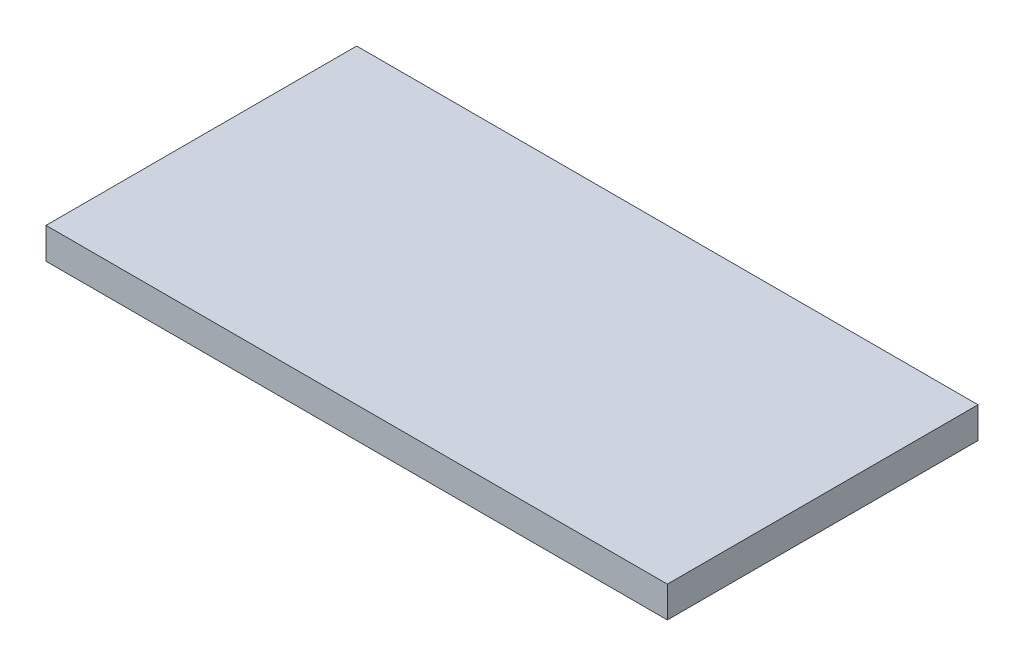
ISO-10303-21;
HEADER;
FILE_DESCRIPTION(('STEP AP214'),'2;1');
FILE_NAME('part.step','',(''),(''),'','','');
FILE_SCHEMA(('AUTOMOTIVE_DESIGN { 1 0 10303 214 1 1 1 1 }'));
ENDSEC;
DATA;
#1=APPLICATION_CONTEXT('core data for automotive mechanical design processes');
#2=APPLICATION_PROTOCOL_DEFINITION('international standard','automotive_design',2000,#1);
#3=PRODUCT_CONTEXT('',#1,'mechanical');
#4=PRODUCT('Part','Part','',(#3));
#5=PRODUCT_RELATED_PRODUCT_CATEGORY('part','',(#4));
#6=PRODUCT_DEFINITION_FORMATION('','',#4);
#7=PRODUCT_DEFINITION_CONTEXT('part definition',#1,'design');
#8=PRODUCT_DEFINITION('design','',#6,#7);
#9=PRODUCT_DEFINITION_SHAPE('','',#8);
#10=(LENGTH_UNIT() NAMED_UNIT(*) SI_UNIT(.MILLI.,.METRE.));
#11=(NAMED_UNIT(*) PLANE_ANGLE_UNIT() SI_UNIT($,.RADIAN.));
#12=(NAMED_UNIT(*) SI_UNIT($,.STERADIAN.) SOLID_ANGLE_UNIT());
#13=UNCERTAINTY_MEASURE_WITH_UNIT(LENGTH_MEASURE(1.E-05),#10,'distance_accuracy_value','');
#14=(GEOMETRIC_REPRESENTATION_CONTEXT(3) GLOBAL_UNCERTAINTY_ASSIGNED_CONTEXT((#13)) GLOBAL_UNIT_ASSIGNED_CONTEXT((#10,
#11,#12)) REPRESENTATION_CONTEXT('',''));
#15=CARTESIAN_POINT('',(0.,0.,0.));
#16=DIRECTION('',(0.,0.,1.));
#17=DIRECTION('',(1.,0.,0.));
#18=AXIS2_PLACEMENT_3D('',#15,#16,#17);
#19=CARTESIAN_POINT('',(63.5,6.35,-31.75));
#20=DIRECTION('',(-1.,0.,0.));
#21=DIRECTION('',(0.,0.,1.));
#22=AXIS2_PLACEMENT_3D('',#19,#20,#21);
#23=PLANE('',#22);
#24=DIRECTION('',(0.,0.,-1.));
#25=VECTOR('',#24,1.);
#26=CARTESIAN_POINT('',(63.5,0.,-31.75));
#27=LINE('',#26,#25);
#28=CARTESIAN_POINT('',(63.5,0.,31.75));
#29=VERTEX_POINT('',#28);
#30=CARTESIAN_POINT('',(63.5,0.,-31.75));
#31=VERTEX_POINT('',#30);
#32=EDGE_CURVE('E99',#29,#31,#27,.T.);
#33=ORIENTED_EDGE('',*,*,#32,.T.);
#34=DIRECTION('',(0.,-1.,0.));
#35=VECTOR('',#34,1.);
#36=CARTESIAN_POINT('',(63.5,6.35,-31.75));
#37=LINE('',#36,#35);
#38=CARTESIAN_POINT('',(63.5,6.35,-31.75));
#39=VERTEX_POINT('',#38);
#40=EDGE_CURVE('E11',#39,#31,#37,.T.);
#41=ORIENTED_EDGE('',*,*,#40,.F.);
#42=DIRECTION('',(0.,0.,-1.));
#43=VECTOR('',#42,1.);
#44=CARTESIAN_POINT('',(63.5,6.35,-31.75));
#45=LINE('',#44,#43);
#46=CARTESIAN_POINT('',(63.5,6.35,31.75));
#47=VERTEX_POINT('',#46);
#48=EDGE_CURVE('E87',#47,#39,#45,.T.);
#49=ORIENTED_EDGE('',*,*,#48,.F.);
#50=DIRECTION('',(0.,-1.,0.));
#51=VECTOR('',#50,1.);
#52=CARTESIAN_POINT('',(63.5,6.35,31.75));
#53=LINE('',#52,#51);
#54=EDGE_CURVE('E95',#47,#29,#53,.T.);
#55=ORIENTED_EDGE('',*,*,#54,.T.);
#56=EDGE_LOOP('',(#33,#41,#49,#55));
#57=FACE_BOUND('',#56,.T.);
#58=ADVANCED_FACE('F36',(#57),#23,.F.);
#59=CARTESIAN_POINT('',(-63.5,6.35,-31.75));
#60=DIRECTION('',(0.,0.,1.));
#61=DIRECTION('',(1.,0.,0.));
#62=AXIS2_PLACEMENT_3D('',#59,#60,#61);
#63=PLANE('',#62);
#64=DIRECTION('',(-1.,0.,0.));
#65=VECTOR('',#64,1.);
#66=CARTESIAN_POINT('',(-63.5,0.,-31.75));
#67=LINE('',#66,#65);
#68=CARTESIAN_POINT('',(-63.5,0.,-31.75));
#69=VERTEX_POINT('',#68);
#70=EDGE_CURVE('E91',#31,#69,#67,.T.);
#71=ORIENTED_EDGE('',*,*,#70,.T.);
#72=DIRECTION('',(0.,-1.,0.));
#73=VECTOR('',#72,1.);
#74=CARTESIAN_POINT('',(-63.5,6.35,-31.75));
#75=LINE('',#74,#73);
#76=CARTESIAN_POINT('',(-63.5,6.35,-31.75));
#77=VERTEX_POINT('',#76);
#78=EDGE_CURVE('E44',#77,#69,#75,.T.);
#79=ORIENTED_EDGE('',*,*,#78,.F.);
#80=DIRECTION('',(-1.,0.,0.));
#81=VECTOR('',#80,1.);
#82=CARTESIAN_POINT('',(-63.5,6.35,-31.75));
#83=LINE('',#82,#81);
#84=EDGE_CURVE('E82',#39,#77,#83,.T.);
#85=ORIENTED_EDGE('',*,*,#84,.F.);
#86=ORIENTED_EDGE('',*,*,#40,.T.);
#87=EDGE_LOOP('',(#71,#79,#85,#86));
#88=FACE_BOUND('',#87,.T.);
#89=ADVANCED_FACE('F90',(#88),#63,.F.);
#90=CARTESIAN_POINT('',(-63.5,6.35,-31.75));
#91=DIRECTION('',(1.,0.,0.));
#92=DIRECTION('',(0.,0.,-1.));
#93=AXIS2_PLACEMENT_3D('',#90,#91,#92);
#94=PLANE('',#93);
#95=DIRECTION('',(0.,0.,1.));
#96=VECTOR('',#95,1.);
#97=CARTESIAN_POINT('',(-63.5,0.,-31.75));
#98=LINE('',#97,#96);
#99=CARTESIAN_POINT('',(-63.5,0.,31.75));
#100=VERTEX_POINT('',#99);
#101=EDGE_CURVE('E69',#69,#100,#98,.T.);
#102=ORIENTED_EDGE('',*,*,#101,.T.);
#103=DIRECTION('',(0.,-1.,0.));
#104=VECTOR('',#103,1.);
#105=CARTESIAN_POINT('',(-63.5,6.35,31.75));
#106=LINE('',#105,#104);
#107=CARTESIAN_POINT('',(-63.5,6.35,31.75));
#108=VERTEX_POINT('',#107);
#109=EDGE_CURVE('E92',#108,#100,#106,.T.);
#110=ORIENTED_EDGE('',*,*,#109,.F.);
#111=DIRECTION('',(0.,0.,1.));
#112=VECTOR('',#111,1.);
#113=CARTESIAN_POINT('',(-63.5,6.35,-31.75));
#114=LINE('',#113,#112);
#115=EDGE_CURVE('E85',#77,#108,#114,.T.);
#116=ORIENTED_EDGE('',*,*,#115,.F.);
#117=ORIENTED_EDGE('',*,*,#78,.T.);
#118=EDGE_LOOP('',(#102,#110,#116,#117));
#119=FACE_BOUND('',#118,.T.);
#120=ADVANCED_FACE('F93',(#119),#94,.F.);
#121=CARTESIAN_POINT('',(-63.5,6.35,31.75));
#122=DIRECTION('',(0.,0.,-1.));
#123=DIRECTION('',(-1.,0.,0.));
#124=AXIS2_PLACEMENT_3D('',#121,#122,#123);
#125=PLANE('',#124);
#126=DIRECTION('',(1.,0.,0.));
#127=VECTOR('',#126,1.);
#128=CARTESIAN_POINT('',(-63.5,0.,31.75));
#129=LINE('',#128,#127);
#130=EDGE_CURVE('E75',#100,#29,#129,.T.);
#131=ORIENTED_EDGE('',*,*,#130,.T.);
#132=ORIENTED_EDGE('',*,*,#54,.F.);
#133=DIRECTION('',(1.,0.,0.));
#134=VECTOR('',#133,1.);
#135=CARTESIAN_POINT('',(-63.5,6.35,31.75));
#136=LINE('',#135,#134);
#137=EDGE_CURVE('E52',#108,#47,#136,.T.);
#138=ORIENTED_EDGE('',*,*,#137,.F.);
#139=ORIENTED_EDGE('',*,*,#109,.T.);
#140=EDGE_LOOP('',(#131,#132,#138,#139));
#141=FACE_BOUND('',#140,.T.);
#142=ADVANCED_FACE('F106',(#141),#125,.F.);
#143=CARTESIAN_POINT('',(0.,6.35,0.));
#144=DIRECTION('',(0.,1.,0.));
#145=DIRECTION('',(0.,0.,1.));
#146=AXIS2_PLACEMENT_3D('',#143,#144,#145);
#147=PLANE('',#146);
#148=ORIENTED_EDGE('',*,*,#48,.T.);
#149=ORIENTED_EDGE('',*,*,#84,.T.);
#150=ORIENTED_EDGE('',*,*,#115,.T.);
#151=ORIENTED_EDGE('',*,*,#137,.T.);
#152=EDGE_LOOP('',(#148,#149,#150,#151));
#153=FACE_BOUND('',#152,.T.);
#154=ADVANCED_FACE('F83',(#153),#147,.T.);
#155=CARTESIAN_POINT('',(0.,0.,0.));
#156=DIRECTION('',(0.,1.,0.));
#157=DIRECTION('',(0.,0.,1.));
#158=AXIS2_PLACEMENT_3D('',#155,#156,#157);
#159=PLANE('',#158);
#160=ORIENTED_EDGE('',*,*,#32,.F.);
#161=ORIENTED_EDGE('',*,*,#130,.F.);
#162=ORIENTED_EDGE('',*,*,#101,.F.);
#163=ORIENTED_EDGE('',*,*,#70,.F.);
#164=EDGE_LOOP('',(#160,#161,#162,#163));
#165=FACE_BOUND('',#164,.T.);
#166=ADVANCED_FACE('F109',(#165),#159,.F.);
#167=CLOSED_SHELL('',(#58,#89,#120,#142,#154,#166));
#168=MANIFOLD_SOLID_BREP('B2',#167);
#169=ADVANCED_BREP_SHAPE_REPRESENTATION('',(#18,#168),#14);
#170=SHAPE_DEFINITION_REPRESENTATION(#9,#169);
ENDSEC;
END-ISO-10303-21;
